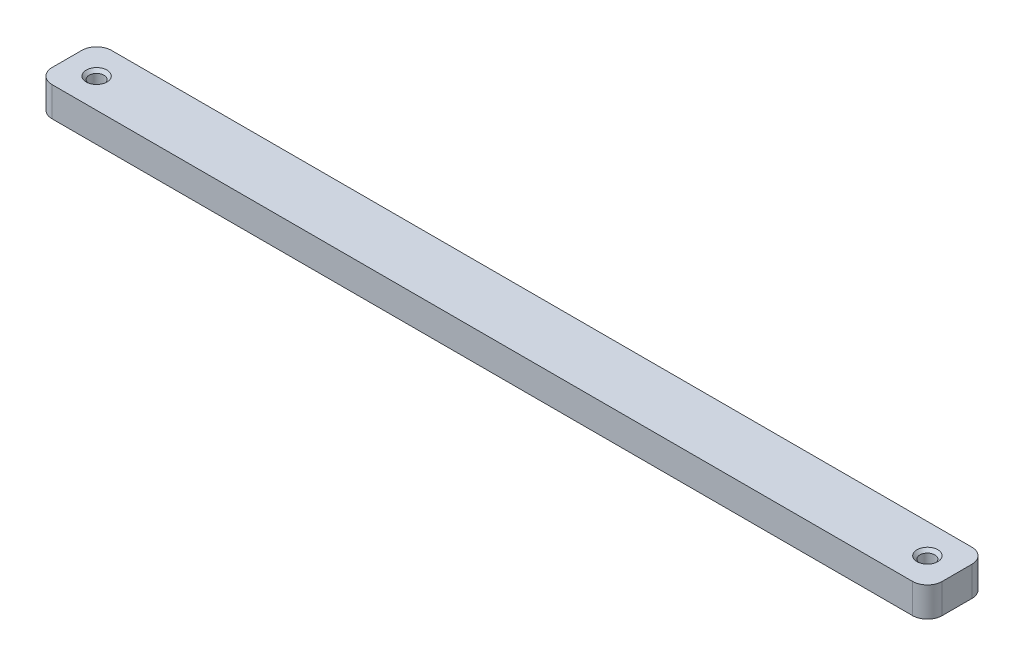
ISO-10303-21;
HEADER;
FILE_DESCRIPTION(('STEP AP214'),'2;1');
FILE_NAME('part.step','',(''),(''),'','','');
FILE_SCHEMA(('AUTOMOTIVE_DESIGN { 1 0 10303 214 1 1 1 1 }'));
ENDSEC;
DATA;
#1=APPLICATION_CONTEXT('core data for automotive mechanical design processes');
#2=APPLICATION_PROTOCOL_DEFINITION('international standard','automotive_design',2000,#1);
#3=PRODUCT_CONTEXT('',#1,'mechanical');
#4=PRODUCT('Part','Part','',(#3));
#5=PRODUCT_RELATED_PRODUCT_CATEGORY('part','',(#4));
#6=PRODUCT_DEFINITION_FORMATION('','',#4);
#7=PRODUCT_DEFINITION_CONTEXT('part definition',#1,'design');
#8=PRODUCT_DEFINITION('design','',#6,#7);
#9=PRODUCT_DEFINITION_SHAPE('','',#8);
#10=(LENGTH_UNIT() NAMED_UNIT(*) SI_UNIT(.MILLI.,.METRE.));
#11=(NAMED_UNIT(*) PLANE_ANGLE_UNIT() SI_UNIT($,.RADIAN.));
#12=(NAMED_UNIT(*) SI_UNIT($,.STERADIAN.) SOLID_ANGLE_UNIT());
#13=UNCERTAINTY_MEASURE_WITH_UNIT(LENGTH_MEASURE(1.E-05),#10,'distance_accuracy_value','');
#14=(GEOMETRIC_REPRESENTATION_CONTEXT(3) GLOBAL_UNCERTAINTY_ASSIGNED_CONTEXT((#13)) GLOBAL_UNIT_ASSIGNED_CONTEXT((#10,
#11,#12)) REPRESENTATION_CONTEXT('',''));
#15=CARTESIAN_POINT('',(0.,0.,0.));
#16=DIRECTION('',(0.,0.,1.));
#17=DIRECTION('',(1.,0.,0.));
#18=AXIS2_PLACEMENT_3D('',#15,#16,#17);
#19=CARTESIAN_POINT('',(-150.,10.,10.));
#20=DIRECTION('',(1.,0.,0.));
#21=DIRECTION('',(0.,0.,-1.));
#22=AXIS2_PLACEMENT_3D('',#19,#20,#21);
#23=PLANE('',#22);
#24=DIRECTION('',(0.,0.,1.));
#25=VECTOR('',#24,1.);
#26=CARTESIAN_POINT('',(-150.,0.,10.));
#27=LINE('',#26,#25);
#28=CARTESIAN_POINT('',(-150.,0.,-4.99999999999998));
#29=VERTEX_POINT('',#28);
#30=CARTESIAN_POINT('',(-150.,0.,5.00000000000002));
#31=VERTEX_POINT('',#30);
#32=EDGE_CURVE('E133',#29,#31,#27,.T.);
#33=ORIENTED_EDGE('',*,*,#32,.T.);
#34=DIRECTION('',(0.,-1.,0.));
#35=VECTOR('',#34,1.);
#36=CARTESIAN_POINT('',(-150.,10.,5.00000000000002));
#37=LINE('',#36,#35);
#38=CARTESIAN_POINT('',(-150.,10.,5.00000000000002));
#39=VERTEX_POINT('',#38);
#40=EDGE_CURVE('E110',#31,#39,#37,.F.);
#41=ORIENTED_EDGE('',*,*,#40,.T.);
#42=DIRECTION('',(0.,0.,1.));
#43=VECTOR('',#42,1.);
#44=CARTESIAN_POINT('',(-150.,10.,10.));
#45=LINE('',#44,#43);
#46=CARTESIAN_POINT('',(-150.,10.,-4.99999999999998));
#47=VERTEX_POINT('',#46);
#48=EDGE_CURVE('E143',#47,#39,#45,.T.);
#49=ORIENTED_EDGE('',*,*,#48,.F.);
#50=DIRECTION('',(0.,-1.,0.));
#51=VECTOR('',#50,1.);
#52=CARTESIAN_POINT('',(-150.,10.,-4.99999999999998));
#53=LINE('',#52,#51);
#54=EDGE_CURVE('E115',#47,#29,#53,.T.);
#55=ORIENTED_EDGE('',*,*,#54,.T.);
#56=EDGE_LOOP('',(#33,#41,#49,#55));
#57=FACE_BOUND('',#56,.T.);
#58=ADVANCED_FACE('F38',(#57),#23,.F.);
#59=CARTESIAN_POINT('',(150.,10.,9.99999999999998));
#60=DIRECTION('',(0.,0.,-1.));
#61=DIRECTION('',(-1.,0.,0.));
#62=AXIS2_PLACEMENT_3D('',#59,#60,#61);
#63=PLANE('',#62);
#64=DIRECTION('',(1.,0.,0.));
#65=VECTOR('',#64,1.);
#66=CARTESIAN_POINT('',(150.,10.,9.99999999999998));
#67=LINE('',#66,#65);
#68=CARTESIAN_POINT('',(-145.,10.,10.));
#69=VERTEX_POINT('',#68);
#70=CARTESIAN_POINT('',(145.,10.,9.99999999999998));
#71=VERTEX_POINT('',#70);
#72=EDGE_CURVE('E125',#69,#71,#67,.T.);
#73=ORIENTED_EDGE('',*,*,#72,.F.);
#74=DIRECTION('',(0.,-1.,0.));
#75=VECTOR('',#74,1.);
#76=CARTESIAN_POINT('',(-145.,10.,10.));
#77=LINE('',#76,#75);
#78=CARTESIAN_POINT('',(-145.,0.,10.));
#79=VERTEX_POINT('',#78);
#80=EDGE_CURVE('E109',#69,#79,#77,.T.);
#81=ORIENTED_EDGE('',*,*,#80,.T.);
#82=DIRECTION('',(1.,0.,0.));
#83=VECTOR('',#82,1.);
#84=CARTESIAN_POINT('',(150.,0.,9.99999999999998));
#85=LINE('',#84,#83);
#86=CARTESIAN_POINT('',(145.,0.,9.99999999999998));
#87=VERTEX_POINT('',#86);
#88=EDGE_CURVE('E122',#79,#87,#85,.T.);
#89=ORIENTED_EDGE('',*,*,#88,.T.);
#90=DIRECTION('',(0.,-1.,0.));
#91=VECTOR('',#90,1.);
#92=CARTESIAN_POINT('',(145.,10.,9.99999999999998));
#93=LINE('',#92,#91);
#94=EDGE_CURVE('E127',#87,#71,#93,.F.);
#95=ORIENTED_EDGE('',*,*,#94,.T.);
#96=EDGE_LOOP('',(#73,#81,#89,#95));
#97=FACE_BOUND('',#96,.T.);
#98=ADVANCED_FACE('F121',(#97),#63,.F.);
#99=CARTESIAN_POINT('',(150.,10.,9.99999999999998));
#100=DIRECTION('',(-1.,0.,0.));
#101=DIRECTION('',(0.,0.,1.));
#102=AXIS2_PLACEMENT_3D('',#99,#100,#101);
#103=PLANE('',#102);
#104=DIRECTION('',(0.,0.,-1.));
#105=VECTOR('',#104,1.);
#106=CARTESIAN_POINT('',(150.,10.,9.99999999999998));
#107=LINE('',#106,#105);
#108=CARTESIAN_POINT('',(150.,10.,4.99999999999998));
#109=VERTEX_POINT('',#108);
#110=CARTESIAN_POINT('',(150.,10.,-5.00000000000002));
#111=VERTEX_POINT('',#110);
#112=EDGE_CURVE('E174',#109,#111,#107,.T.);
#113=ORIENTED_EDGE('',*,*,#112,.F.);
#114=DIRECTION('',(0.,-1.,0.));
#115=VECTOR('',#114,1.);
#116=CARTESIAN_POINT('',(150.,10.,4.99999999999998));
#117=LINE('',#116,#115);
#118=CARTESIAN_POINT('',(150.,0.,4.99999999999998));
#119=VERTEX_POINT('',#118);
#120=EDGE_CURVE('E11',#109,#119,#117,.T.);
#121=ORIENTED_EDGE('',*,*,#120,.T.);
#122=DIRECTION('',(0.,0.,-1.));
#123=VECTOR('',#122,1.);
#124=CARTESIAN_POINT('',(150.,0.,9.99999999999998));
#125=LINE('',#124,#123);
#126=CARTESIAN_POINT('',(150.,0.,-5.00000000000002));
#127=VERTEX_POINT('',#126);
#128=EDGE_CURVE('E132',#119,#127,#125,.T.);
#129=ORIENTED_EDGE('',*,*,#128,.T.);
#130=DIRECTION('',(0.,-1.,0.));
#131=VECTOR('',#130,1.);
#132=CARTESIAN_POINT('',(150.,10.,-5.00000000000002));
#133=LINE('',#132,#131);
#134=EDGE_CURVE('E46',#127,#111,#133,.F.);
#135=ORIENTED_EDGE('',*,*,#134,.T.);
#136=EDGE_LOOP('',(#113,#121,#129,#135));
#137=FACE_BOUND('',#136,.T.);
#138=ADVANCED_FACE('F173',(#137),#103,.F.);
#139=CARTESIAN_POINT('',(150.,10.,-10.));
#140=DIRECTION('',(0.,0.,1.));
#141=DIRECTION('',(1.,0.,0.));
#142=AXIS2_PLACEMENT_3D('',#139,#140,#141);
#143=PLANE('',#142);
#144=DIRECTION('',(-1.,0.,0.));
#145=VECTOR('',#144,1.);
#146=CARTESIAN_POINT('',(150.,0.,-10.));
#147=LINE('',#146,#145);
#148=CARTESIAN_POINT('',(145.,0.,-10.));
#149=VERTEX_POINT('',#148);
#150=CARTESIAN_POINT('',(-145.,0.,-9.99999999999998));
#151=VERTEX_POINT('',#150);
#152=EDGE_CURVE('E136',#149,#151,#147,.T.);
#153=ORIENTED_EDGE('',*,*,#152,.T.);
#154=DIRECTION('',(0.,-1.,0.));
#155=VECTOR('',#154,1.);
#156=CARTESIAN_POINT('',(-145.,10.,-9.99999999999998));
#157=LINE('',#156,#155);
#158=CARTESIAN_POINT('',(-145.,10.,-9.99999999999998));
#159=VERTEX_POINT('',#158);
#160=EDGE_CURVE('E53',#151,#159,#157,.F.);
#161=ORIENTED_EDGE('',*,*,#160,.T.);
#162=DIRECTION('',(-1.,0.,0.));
#163=VECTOR('',#162,1.);
#164=CARTESIAN_POINT('',(150.,10.,-10.));
#165=LINE('',#164,#163);
#166=CARTESIAN_POINT('',(145.,10.,-10.));
#167=VERTEX_POINT('',#166);
#168=EDGE_CURVE('E152',#167,#159,#165,.T.);
#169=ORIENTED_EDGE('',*,*,#168,.F.);
#170=DIRECTION('',(0.,-1.,0.));
#171=VECTOR('',#170,1.);
#172=CARTESIAN_POINT('',(145.,10.,-10.));
#173=LINE('',#172,#171);
#174=EDGE_CURVE('E167',#167,#149,#173,.T.);
#175=ORIENTED_EDGE('',*,*,#174,.T.);
#176=EDGE_LOOP('',(#153,#161,#169,#175));
#177=FACE_BOUND('',#176,.T.);
#178=ADVANCED_FACE('F183',(#177),#143,.F.);
#179=CARTESIAN_POINT('',(-150.,10.,-9.99999999999998));
#180=DIRECTION('',(0.,1.,0.));
#181=DIRECTION('',(0.,0.,1.));
#182=AXIS2_PLACEMENT_3D('',#179,#180,#181);
#183=PLANE('',#182);
#184=CARTESIAN_POINT('',(-140.,10.,0.));
#185=DIRECTION('',(0.,1.,0.));
#186=DIRECTION('',(0.,0.,1.));
#187=AXIS2_PLACEMENT_3D('',#184,#185,#186);
#188=CIRCLE('',#187,3.5);
#189=CARTESIAN_POINT('',(-140.,10.,3.5));
#190=VERTEX_POINT('',#189);
#191=EDGE_CURVE('E199',#190,#190,#188,.T.);
#192=ORIENTED_EDGE('',*,*,#191,.F.);
#193=EDGE_LOOP('',(#192));
#194=FACE_BOUND('',#193,.T.);
#195=CARTESIAN_POINT('',(140.,10.,0.));
#196=DIRECTION('',(0.,1.,0.));
#197=DIRECTION('',(0.,0.,1.));
#198=AXIS2_PLACEMENT_3D('',#195,#196,#197);
#199=CIRCLE('',#198,3.5);
#200=CARTESIAN_POINT('',(140.,10.,3.5));
#201=VERTEX_POINT('',#200);
#202=EDGE_CURVE('E150',#201,#201,#199,.T.);
#203=ORIENTED_EDGE('',*,*,#202,.F.);
#204=EDGE_LOOP('',(#203));
#205=FACE_BOUND('',#204,.T.);
#206=ORIENTED_EDGE('',*,*,#48,.T.);
#207=CARTESIAN_POINT('',(-145.,10.,5.00000000000002));
#208=DIRECTION('',(0.,1.,0.));
#209=DIRECTION('',(0.,0.,1.));
#210=AXIS2_PLACEMENT_3D('',#207,#208,#209);
#211=CIRCLE('',#210,5.);
#212=EDGE_CURVE('E165',#39,#69,#211,.T.);
#213=ORIENTED_EDGE('',*,*,#212,.T.);
#214=ORIENTED_EDGE('',*,*,#72,.T.);
#215=CARTESIAN_POINT('',(145.,10.,4.99999999999998));
#216=DIRECTION('',(0.,1.,0.));
#217=DIRECTION('',(0.,0.,1.));
#218=AXIS2_PLACEMENT_3D('',#215,#216,#217);
#219=CIRCLE('',#218,5.);
#220=EDGE_CURVE('E161',#71,#109,#219,.T.);
#221=ORIENTED_EDGE('',*,*,#220,.T.);
#222=ORIENTED_EDGE('',*,*,#112,.T.);
#223=CARTESIAN_POINT('',(145.,10.,-5.00000000000002));
#224=DIRECTION('',(0.,1.,0.));
#225=DIRECTION('',(0.,0.,1.));
#226=AXIS2_PLACEMENT_3D('',#223,#224,#225);
#227=CIRCLE('',#226,5.);
#228=EDGE_CURVE('E60',#111,#167,#227,.T.);
#229=ORIENTED_EDGE('',*,*,#228,.T.);
#230=ORIENTED_EDGE('',*,*,#168,.T.);
#231=CARTESIAN_POINT('',(-145.,10.,-4.99999999999998));
#232=DIRECTION('',(0.,1.,0.));
#233=DIRECTION('',(0.,0.,1.));
#234=AXIS2_PLACEMENT_3D('',#231,#232,#233);
#235=CIRCLE('',#234,5.);
#236=EDGE_CURVE('E163',#159,#47,#235,.T.);
#237=ORIENTED_EDGE('',*,*,#236,.T.);
#238=EDGE_LOOP('',(#206,#213,#214,#221,#222,#229,#230,#237));
#239=FACE_BOUND('',#238,.T.);
#240=ADVANCED_FACE('F178',(#194,#205,#239),#183,.T.);
#241=CARTESIAN_POINT('',(-150.,0.,-9.99999999999998));
#242=DIRECTION('',(0.,1.,0.));
#243=DIRECTION('',(0.,0.,1.));
#244=AXIS2_PLACEMENT_3D('',#241,#242,#243);
#245=PLANE('',#244);
#246=CARTESIAN_POINT('',(-140.,0.,0.));
#247=DIRECTION('',(0.,1.,0.));
#248=DIRECTION('',(0.,0.,1.));
#249=AXIS2_PLACEMENT_3D('',#246,#247,#248);
#250=CIRCLE('',#249,2.5);
#251=CARTESIAN_POINT('',(-140.,0.,2.5));
#252=VERTEX_POINT('',#251);
#253=EDGE_CURVE('E147',#252,#252,#250,.T.);
#254=ORIENTED_EDGE('',*,*,#253,.T.);
#255=EDGE_LOOP('',(#254));
#256=FACE_BOUND('',#255,.T.);
#257=CARTESIAN_POINT('',(140.,0.,0.));
#258=DIRECTION('',(0.,1.,0.));
#259=DIRECTION('',(0.,0.,1.));
#260=AXIS2_PLACEMENT_3D('',#257,#258,#259);
#261=CIRCLE('',#260,2.5);
#262=CARTESIAN_POINT('',(140.,0.,2.5));
#263=VERTEX_POINT('',#262);
#264=EDGE_CURVE('E138',#263,#263,#261,.T.);
#265=ORIENTED_EDGE('',*,*,#264,.T.);
#266=EDGE_LOOP('',(#265));
#267=FACE_BOUND('',#266,.T.);
#268=ORIENTED_EDGE('',*,*,#88,.F.);
#269=CARTESIAN_POINT('',(-145.,0.,5.00000000000002));
#270=DIRECTION('',(0.,1.,0.));
#271=DIRECTION('',(0.,0.,1.));
#272=AXIS2_PLACEMENT_3D('',#269,#270,#271);
#273=CIRCLE('',#272,5.);
#274=EDGE_CURVE('E105',#79,#31,#273,.F.);
#275=ORIENTED_EDGE('',*,*,#274,.T.);
#276=ORIENTED_EDGE('',*,*,#32,.F.);
#277=CARTESIAN_POINT('',(-145.,0.,-4.99999999999998));
#278=DIRECTION('',(0.,1.,0.));
#279=DIRECTION('',(0.,0.,1.));
#280=AXIS2_PLACEMENT_3D('',#277,#278,#279);
#281=CIRCLE('',#280,5.);
#282=EDGE_CURVE('E116',#29,#151,#281,.F.);
#283=ORIENTED_EDGE('',*,*,#282,.T.);
#284=ORIENTED_EDGE('',*,*,#152,.F.);
#285=CARTESIAN_POINT('',(145.,0.,-5.00000000000002));
#286=DIRECTION('',(0.,1.,0.));
#287=DIRECTION('',(0.,0.,1.));
#288=AXIS2_PLACEMENT_3D('',#285,#286,#287);
#289=CIRCLE('',#288,5.);
#290=EDGE_CURVE('E126',#149,#127,#289,.F.);
#291=ORIENTED_EDGE('',*,*,#290,.T.);
#292=ORIENTED_EDGE('',*,*,#128,.F.);
#293=CARTESIAN_POINT('',(145.,0.,4.99999999999998));
#294=DIRECTION('',(0.,1.,0.));
#295=DIRECTION('',(0.,0.,1.));
#296=AXIS2_PLACEMENT_3D('',#293,#294,#295);
#297=CIRCLE('',#296,5.);
#298=EDGE_CURVE('E131',#119,#87,#297,.F.);
#299=ORIENTED_EDGE('',*,*,#298,.T.);
#300=EDGE_LOOP('',(#268,#275,#276,#283,#284,#291,#292,#299));
#301=FACE_BOUND('',#300,.T.);
#302=ADVANCED_FACE('F129',(#256,#267,#301),#245,.F.);
#303=CARTESIAN_POINT('',(140.,10.,0.));
#304=DIRECTION('',(0.,1.,0.));
#305=DIRECTION('',(0.,0.,1.));
#306=AXIS2_PLACEMENT_3D('',#303,#304,#305);
#307=CYLINDRICAL_SURFACE('',#306,2.5);
#308=CARTESIAN_POINT('',(140.,9.,0.));
#309=DIRECTION('',(0.,1.,0.));
#310=DIRECTION('',(0.,0.,1.));
#311=AXIS2_PLACEMENT_3D('',#308,#309,#310);
#312=CIRCLE('',#311,2.5);
#313=CARTESIAN_POINT('',(140.,9.,2.5));
#314=VERTEX_POINT('',#313);
#315=EDGE_CURVE('E146',#314,#314,#312,.T.);
#316=ORIENTED_EDGE('',*,*,#315,.T.);
#317=EDGE_LOOP('',(#316));
#318=FACE_BOUND('',#317,.T.);
#319=ORIENTED_EDGE('',*,*,#264,.F.);
#320=EDGE_LOOP('',(#319));
#321=FACE_BOUND('',#320,.T.);
#322=ADVANCED_FACE('F213',(#318,#321),#307,.F.);
#323=CARTESIAN_POINT('',(140.,10.,0.));
#324=DIRECTION('',(0.,1.,0.));
#325=DIRECTION('',(0.,0.,1.));
#326=AXIS2_PLACEMENT_3D('',#323,#324,#325);
#327=CONICAL_SURFACE('',#326,3.5,0.785398163397447);
#328=ORIENTED_EDGE('',*,*,#315,.F.);
#329=EDGE_LOOP('',(#328));
#330=FACE_BOUND('',#329,.T.);
#331=ORIENTED_EDGE('',*,*,#202,.T.);
#332=EDGE_LOOP('',(#331));
#333=FACE_BOUND('',#332,.T.);
#334=ADVANCED_FACE('F210',(#330,#333),#327,.F.);
#335=CARTESIAN_POINT('',(-140.,10.,0.));
#336=DIRECTION('',(0.,1.,0.));
#337=DIRECTION('',(0.,0.,1.));
#338=AXIS2_PLACEMENT_3D('',#335,#336,#337);
#339=CYLINDRICAL_SURFACE('',#338,2.5);
#340=CARTESIAN_POINT('',(-140.,9.,0.));
#341=DIRECTION('',(0.,1.,0.));
#342=DIRECTION('',(0.,0.,1.));
#343=AXIS2_PLACEMENT_3D('',#340,#341,#342);
#344=CIRCLE('',#343,2.5);
#345=CARTESIAN_POINT('',(-140.,9.,2.5));
#346=VERTEX_POINT('',#345);
#347=EDGE_CURVE('E151',#346,#346,#344,.T.);
#348=ORIENTED_EDGE('',*,*,#347,.T.);
#349=EDGE_LOOP('',(#348));
#350=FACE_BOUND('',#349,.T.);
#351=ORIENTED_EDGE('',*,*,#253,.F.);
#352=EDGE_LOOP('',(#351));
#353=FACE_BOUND('',#352,.T.);
#354=ADVANCED_FACE('F212',(#350,#353),#339,.F.);
#355=CARTESIAN_POINT('',(-140.,10.,0.));
#356=DIRECTION('',(0.,1.,0.));
#357=DIRECTION('',(0.,0.,1.));
#358=AXIS2_PLACEMENT_3D('',#355,#356,#357);
#359=CONICAL_SURFACE('',#358,3.5,0.785398163397447);
#360=ORIENTED_EDGE('',*,*,#347,.F.);
#361=EDGE_LOOP('',(#360));
#362=FACE_BOUND('',#361,.T.);
#363=ORIENTED_EDGE('',*,*,#191,.T.);
#364=EDGE_LOOP('',(#363));
#365=FACE_BOUND('',#364,.T.);
#366=ADVANCED_FACE('F203',(#362,#365),#359,.F.);
#367=CARTESIAN_POINT('',(-145.,10.,5.00000000000002));
#368=DIRECTION('',(0.,-1.,0.));
#369=DIRECTION('',(0.,0.,-1.));
#370=AXIS2_PLACEMENT_3D('',#367,#368,#369);
#371=CYLINDRICAL_SURFACE('',#370,5.);
#372=ORIENTED_EDGE('',*,*,#212,.F.);
#373=ORIENTED_EDGE('',*,*,#40,.F.);
#374=ORIENTED_EDGE('',*,*,#274,.F.);
#375=ORIENTED_EDGE('',*,*,#80,.F.);
#376=EDGE_LOOP('',(#372,#373,#374,#375));
#377=FACE_BOUND('',#376,.T.);
#378=ADVANCED_FACE('F108',(#377),#371,.T.);
#379=CARTESIAN_POINT('',(-145.,10.,-4.99999999999998));
#380=DIRECTION('',(0.,-1.,0.));
#381=DIRECTION('',(0.,0.,-1.));
#382=AXIS2_PLACEMENT_3D('',#379,#380,#381);
#383=CYLINDRICAL_SURFACE('',#382,5.);
#384=ORIENTED_EDGE('',*,*,#236,.F.);
#385=ORIENTED_EDGE('',*,*,#160,.F.);
#386=ORIENTED_EDGE('',*,*,#282,.F.);
#387=ORIENTED_EDGE('',*,*,#54,.F.);
#388=EDGE_LOOP('',(#384,#385,#386,#387));
#389=FACE_BOUND('',#388,.T.);
#390=ADVANCED_FACE('F187',(#389),#383,.T.);
#391=CARTESIAN_POINT('',(145.,10.,4.99999999999998));
#392=DIRECTION('',(0.,-1.,0.));
#393=DIRECTION('',(0.,0.,-1.));
#394=AXIS2_PLACEMENT_3D('',#391,#392,#393);
#395=CYLINDRICAL_SURFACE('',#394,5.);
#396=ORIENTED_EDGE('',*,*,#220,.F.);
#397=ORIENTED_EDGE('',*,*,#94,.F.);
#398=ORIENTED_EDGE('',*,*,#298,.F.);
#399=ORIENTED_EDGE('',*,*,#120,.F.);
#400=EDGE_LOOP('',(#396,#397,#398,#399));
#401=FACE_BOUND('',#400,.T.);
#402=ADVANCED_FACE('F236',(#401),#395,.T.);
#403=CARTESIAN_POINT('',(145.,10.,-5.00000000000002));
#404=DIRECTION('',(0.,-1.,0.));
#405=DIRECTION('',(0.,0.,-1.));
#406=AXIS2_PLACEMENT_3D('',#403,#404,#405);
#407=CYLINDRICAL_SURFACE('',#406,5.);
#408=ORIENTED_EDGE('',*,*,#228,.F.);
#409=ORIENTED_EDGE('',*,*,#134,.F.);
#410=ORIENTED_EDGE('',*,*,#290,.F.);
#411=ORIENTED_EDGE('',*,*,#174,.F.);
#412=EDGE_LOOP('',(#408,#409,#410,#411));
#413=FACE_BOUND('',#412,.T.);
#414=ADVANCED_FACE('F40',(#413),#407,.T.);
#415=CLOSED_SHELL('',(#58,#98,#138,#178,#240,#302,#322,#334,#354,#366,#378,#390,#402,#414));
#416=MANIFOLD_SOLID_BREP('B2',#415);
#417=ADVANCED_BREP_SHAPE_REPRESENTATION('',(#18,#416),#14);
#418=SHAPE_DEFINITION_REPRESENTATION(#9,#417);
ENDSEC;
END-ISO-10303-21;
